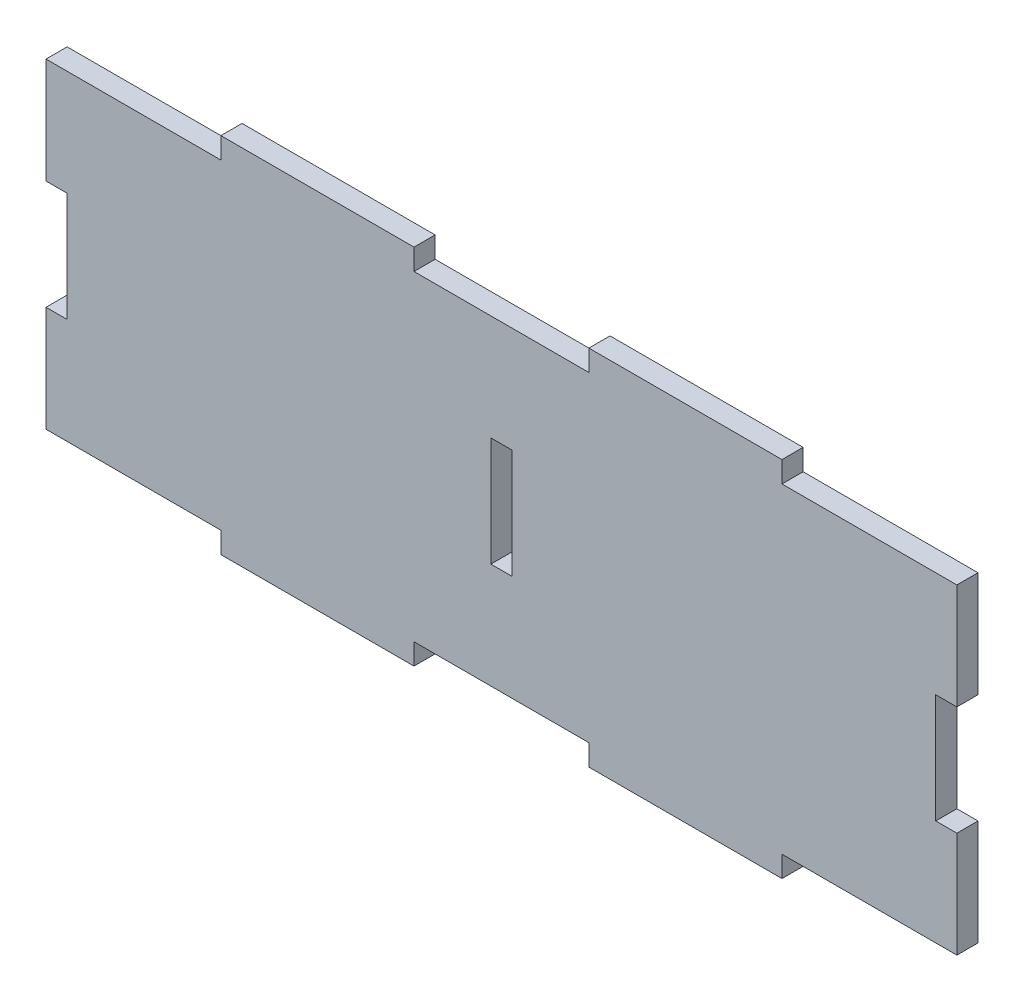
ISO-10303-21;
HEADER;
FILE_DESCRIPTION(('STEP AP214'),'2;1');
FILE_NAME('part.step','',(''),(''),'','','');
FILE_SCHEMA(('AUTOMOTIVE_DESIGN { 1 0 10303 214 1 1 1 1 }'));
ENDSEC;
DATA;
#1=APPLICATION_CONTEXT('core data for automotive mechanical design processes');
#2=APPLICATION_PROTOCOL_DEFINITION('international standard','automotive_design',2000,#1);
#3=PRODUCT_CONTEXT('',#1,'mechanical');
#4=PRODUCT('Part','Part','',(#3));
#5=PRODUCT_RELATED_PRODUCT_CATEGORY('part','',(#4));
#6=PRODUCT_DEFINITION_FORMATION('','',#4);
#7=PRODUCT_DEFINITION_CONTEXT('part definition',#1,'design');
#8=PRODUCT_DEFINITION('design','',#6,#7);
#9=PRODUCT_DEFINITION_SHAPE('','',#8);
#10=(LENGTH_UNIT() NAMED_UNIT(*) SI_UNIT(.MILLI.,.METRE.));
#11=(NAMED_UNIT(*) PLANE_ANGLE_UNIT() SI_UNIT($,.RADIAN.));
#12=(NAMED_UNIT(*) SI_UNIT($,.STERADIAN.) SOLID_ANGLE_UNIT());
#13=UNCERTAINTY_MEASURE_WITH_UNIT(LENGTH_MEASURE(1.E-05),#10,'distance_accuracy_value','');
#14=(GEOMETRIC_REPRESENTATION_CONTEXT(3) GLOBAL_UNCERTAINTY_ASSIGNED_CONTEXT((#13)) GLOBAL_UNIT_ASSIGNED_CONTEXT((#10,
#11,#12)) REPRESENTATION_CONTEXT('',''));
#15=CARTESIAN_POINT('',(0.,0.,0.));
#16=DIRECTION('',(0.,0.,1.));
#17=DIRECTION('',(1.,0.,0.));
#18=AXIS2_PLACEMENT_3D('',#15,#16,#17);
#19=CARTESIAN_POINT('',(0.,0.,5.8));
#20=DIRECTION('',(0.,1.,0.));
#21=DIRECTION('',(0.,0.,1.));
#22=AXIS2_PLACEMENT_3D('',#19,#20,#21);
#23=PLANE('',#22);
#24=DIRECTION('',(1.,0.,0.));
#25=VECTOR('',#24,1.);
#26=CARTESIAN_POINT('',(0.,0.,5.8));
#27=LINE('',#26,#25);
#28=CARTESIAN_POINT('',(202.,0.,5.8));
#29=VERTEX_POINT('',#28);
#30=CARTESIAN_POINT('',(250.,0.,5.8));
#31=VERTEX_POINT('',#30);
#32=EDGE_CURVE('E50',#29,#31,#27,.T.);
#33=ORIENTED_EDGE('',*,*,#32,.F.);
#34=DIRECTION('',(0.,0.,1.));
#35=VECTOR('',#34,1.);
#36=CARTESIAN_POINT('',(202.,0.,-53.3164139829378));
#37=LINE('',#36,#35);
#38=CARTESIAN_POINT('',(202.,0.,0.));
#39=VERTEX_POINT('',#38);
#40=EDGE_CURVE('E256',#39,#29,#37,.T.);
#41=ORIENTED_EDGE('',*,*,#40,.F.);
#42=DIRECTION('',(1.,0.,0.));
#43=VECTOR('',#42,1.);
#44=CARTESIAN_POINT('',(0.,0.,0.));
#45=LINE('',#44,#43);
#46=CARTESIAN_POINT('',(250.,0.,0.));
#47=VERTEX_POINT('',#46);
#48=EDGE_CURVE('E254',#39,#47,#45,.T.);
#49=ORIENTED_EDGE('',*,*,#48,.T.);
#50=DIRECTION('',(0.,0.,-1.));
#51=VECTOR('',#50,1.);
#52=CARTESIAN_POINT('',(250.,0.,5.8));
#53=LINE('',#52,#51);
#54=EDGE_CURVE('E43',#31,#47,#53,.T.);
#55=ORIENTED_EDGE('',*,*,#54,.F.);
#56=EDGE_LOOP('',(#33,#41,#49,#55));
#57=FACE_BOUND('',#56,.T.);
#58=ADVANCED_FACE('F35',(#57),#23,.F.);
#59=CARTESIAN_POINT('',(101.,0.,0.));
#60=VERTEX_POINT('',#59);
#61=CARTESIAN_POINT('',(149.,0.,0.));
#62=VERTEX_POINT('',#61);
#63=EDGE_CURVE('E468',#60,#62,#45,.T.);
#64=ORIENTED_EDGE('',*,*,#63,.T.);
#65=DIRECTION('',(0.,0.,1.));
#66=VECTOR('',#65,1.);
#67=CARTESIAN_POINT('',(149.,0.,-53.3164139829378));
#68=LINE('',#67,#66);
#69=CARTESIAN_POINT('',(149.,0.,5.8));
#70=VERTEX_POINT('',#69);
#71=EDGE_CURVE('E58',#62,#70,#68,.T.);
#72=ORIENTED_EDGE('',*,*,#71,.T.);
#73=CARTESIAN_POINT('',(101.,0.,5.8));
#74=VERTEX_POINT('',#73);
#75=EDGE_CURVE('E451',#74,#70,#27,.T.);
#76=ORIENTED_EDGE('',*,*,#75,.F.);
#77=DIRECTION('',(0.,0.,1.));
#78=VECTOR('',#77,1.);
#79=CARTESIAN_POINT('',(101.,0.,-53.3164139829378));
#80=LINE('',#79,#78);
#81=EDGE_CURVE('E302',#60,#74,#80,.T.);
#82=ORIENTED_EDGE('',*,*,#81,.F.);
#83=EDGE_LOOP('',(#64,#72,#76,#82));
#84=FACE_BOUND('',#83,.T.);
#85=ADVANCED_FACE('F504',(#84),#23,.F.);
#86=CARTESIAN_POINT('',(0.,88.,5.8));
#87=DIRECTION('',(0.,-1.,0.));
#88=DIRECTION('',(0.,0.,-1.));
#89=AXIS2_PLACEMENT_3D('',#86,#87,#88);
#90=PLANE('',#89);
#91=DIRECTION('',(-1.,0.,0.));
#92=VECTOR('',#91,1.);
#93=CARTESIAN_POINT('',(0.,88.,0.));
#94=LINE('',#93,#92);
#95=CARTESIAN_POINT('',(250.,88.,0.));
#96=VERTEX_POINT('',#95);
#97=CARTESIAN_POINT('',(202.,88.,0.));
#98=VERTEX_POINT('',#97);
#99=EDGE_CURVE('E473',#96,#98,#94,.T.);
#100=ORIENTED_EDGE('',*,*,#99,.T.);
#101=DIRECTION('',(0.,0.,1.));
#102=VECTOR('',#101,1.);
#103=CARTESIAN_POINT('',(202.,88.,-53.3164139829378));
#104=LINE('',#103,#102);
#105=CARTESIAN_POINT('',(202.,88.,5.8));
#106=VERTEX_POINT('',#105);
#107=EDGE_CURVE('E312',#98,#106,#104,.T.);
#108=ORIENTED_EDGE('',*,*,#107,.T.);
#109=DIRECTION('',(-1.,0.,0.));
#110=VECTOR('',#109,1.);
#111=CARTESIAN_POINT('',(0.,88.,5.8));
#112=LINE('',#111,#110);
#113=CARTESIAN_POINT('',(250.,88.,5.8));
#114=VERTEX_POINT('',#113);
#115=EDGE_CURVE('E456',#114,#106,#112,.T.);
#116=ORIENTED_EDGE('',*,*,#115,.F.);
#117=DIRECTION('',(0.,0.,-1.));
#118=VECTOR('',#117,1.);
#119=CARTESIAN_POINT('',(250.,88.,5.8));
#120=LINE('',#119,#118);
#121=EDGE_CURVE('E478',#114,#96,#120,.T.);
#122=ORIENTED_EDGE('',*,*,#121,.T.);
#123=EDGE_LOOP('',(#100,#108,#116,#122));
#124=FACE_BOUND('',#123,.T.);
#125=ADVANCED_FACE('F510',(#124),#90,.F.);
#126=DIRECTION('',(0.,0.,1.));
#127=VECTOR('',#126,1.);
#128=CARTESIAN_POINT('',(48.,88.,-53.3164139829378));
#129=LINE('',#128,#127);
#130=CARTESIAN_POINT('',(48.,88.,0.));
#131=VERTEX_POINT('',#130);
#132=CARTESIAN_POINT('',(48.,88.,5.8));
#133=VERTEX_POINT('',#132);
#134=EDGE_CURVE('E347',#131,#133,#129,.T.);
#135=ORIENTED_EDGE('',*,*,#134,.F.);
#136=CARTESIAN_POINT('',(0.,88.,0.));
#137=VERTEX_POINT('',#136);
#138=EDGE_CURVE('E472',#131,#137,#94,.T.);
#139=ORIENTED_EDGE('',*,*,#138,.T.);
#140=DIRECTION('',(0.,0.,-1.));
#141=VECTOR('',#140,1.);
#142=CARTESIAN_POINT('',(0.,88.,5.8));
#143=LINE('',#142,#141);
#144=CARTESIAN_POINT('',(0.,88.,5.8));
#145=VERTEX_POINT('',#144);
#146=EDGE_CURVE('E459',#145,#137,#143,.T.);
#147=ORIENTED_EDGE('',*,*,#146,.F.);
#148=EDGE_CURVE('E455',#133,#145,#112,.T.);
#149=ORIENTED_EDGE('',*,*,#148,.F.);
#150=EDGE_LOOP('',(#135,#139,#147,#149));
#151=FACE_BOUND('',#150,.T.);
#152=ADVANCED_FACE('F552',(#151),#90,.F.);
#153=CARTESIAN_POINT('',(0.,0.,5.8));
#154=DIRECTION('',(1.,0.,0.));
#155=DIRECTION('',(0.,0.,-1.));
#156=AXIS2_PLACEMENT_3D('',#153,#154,#155);
#157=PLANE('',#156);
#158=DIRECTION('',(0.,-1.,0.));
#159=VECTOR('',#158,1.);
#160=CARTESIAN_POINT('',(0.,0.,5.8));
#161=LINE('',#160,#159);
#162=CARTESIAN_POINT('',(0.,29.,5.8));
#163=VERTEX_POINT('',#162);
#164=CARTESIAN_POINT('',(0.,0.,5.8));
#165=VERTEX_POINT('',#164);
#166=EDGE_CURVE('E446',#163,#165,#161,.T.);
#167=ORIENTED_EDGE('',*,*,#166,.F.);
#168=DIRECTION('',(0.,0.,-1.));
#169=VECTOR('',#168,1.);
#170=CARTESIAN_POINT('',(0.,29.,5.801));
#171=LINE('',#170,#169);
#172=CARTESIAN_POINT('',(0.,29.,0.));
#173=VERTEX_POINT('',#172);
#174=EDGE_CURVE('E409',#163,#173,#171,.T.);
#175=ORIENTED_EDGE('',*,*,#174,.T.);
#176=DIRECTION('',(0.,-1.,0.));
#177=VECTOR('',#176,1.);
#178=CARTESIAN_POINT('',(0.,0.,0.));
#179=LINE('',#178,#177);
#180=CARTESIAN_POINT('',(0.,0.,0.));
#181=VERTEX_POINT('',#180);
#182=EDGE_CURVE('E442',#173,#181,#179,.T.);
#183=ORIENTED_EDGE('',*,*,#182,.T.);
#184=DIRECTION('',(0.,0.,-1.));
#185=VECTOR('',#184,1.);
#186=CARTESIAN_POINT('',(0.,0.,5.8));
#187=LINE('',#186,#185);
#188=EDGE_CURVE('E11',#165,#181,#187,.T.);
#189=ORIENTED_EDGE('',*,*,#188,.F.);
#190=EDGE_LOOP('',(#167,#175,#183,#189));
#191=FACE_BOUND('',#190,.T.);
#192=ADVANCED_FACE('F523',(#191),#157,.F.);
#193=CARTESIAN_POINT('',(250.,0.,5.8));
#194=DIRECTION('',(-1.,0.,0.));
#195=DIRECTION('',(0.,0.,1.));
#196=AXIS2_PLACEMENT_3D('',#193,#194,#195);
#197=PLANE('',#196);
#198=DIRECTION('',(0.,1.,0.));
#199=VECTOR('',#198,1.);
#200=CARTESIAN_POINT('',(250.,0.,5.8));
#201=LINE('',#200,#199);
#202=CARTESIAN_POINT('',(250.,59.,5.8));
#203=VERTEX_POINT('',#202);
#204=EDGE_CURVE('E450',#203,#114,#201,.T.);
#205=ORIENTED_EDGE('',*,*,#204,.F.);
#206=DIRECTION('',(0.,0.,-1.));
#207=VECTOR('',#206,1.);
#208=CARTESIAN_POINT('',(250.,59.,5.801));
#209=LINE('',#208,#207);
#210=CARTESIAN_POINT('',(250.,59.,0.));
#211=VERTEX_POINT('',#210);
#212=EDGE_CURVE('E432',#203,#211,#209,.T.);
#213=ORIENTED_EDGE('',*,*,#212,.T.);
#214=DIRECTION('',(0.,1.,0.));
#215=VECTOR('',#214,1.);
#216=CARTESIAN_POINT('',(250.,0.,0.));
#217=LINE('',#216,#215);
#218=EDGE_CURVE('E467',#211,#96,#217,.T.);
#219=ORIENTED_EDGE('',*,*,#218,.T.);
#220=ORIENTED_EDGE('',*,*,#121,.F.);
#221=EDGE_LOOP('',(#205,#213,#219,#220));
#222=FACE_BOUND('',#221,.T.);
#223=ADVANCED_FACE('F520',(#222),#197,.F.);
#224=CARTESIAN_POINT('',(0.,59.,0.));
#225=VERTEX_POINT('',#224);
#226=EDGE_CURVE('E461',#137,#225,#179,.T.);
#227=ORIENTED_EDGE('',*,*,#226,.T.);
#228=DIRECTION('',(0.,0.,-1.));
#229=VECTOR('',#228,1.);
#230=CARTESIAN_POINT('',(0.,59.,5.801));
#231=LINE('',#230,#229);
#232=CARTESIAN_POINT('',(0.,59.,5.8));
#233=VERTEX_POINT('',#232);
#234=EDGE_CURVE('E408',#233,#225,#231,.T.);
#235=ORIENTED_EDGE('',*,*,#234,.F.);
#236=EDGE_CURVE('E443',#145,#233,#161,.T.);
#237=ORIENTED_EDGE('',*,*,#236,.F.);
#238=ORIENTED_EDGE('',*,*,#146,.T.);
#239=EDGE_LOOP('',(#227,#235,#237,#238));
#240=FACE_BOUND('',#239,.T.);
#241=ADVANCED_FACE('F37',(#240),#157,.F.);
#242=CARTESIAN_POINT('',(48.,0.,0.));
#243=VERTEX_POINT('',#242);
#244=EDGE_CURVE('E464',#181,#243,#45,.T.);
#245=ORIENTED_EDGE('',*,*,#244,.T.);
#246=DIRECTION('',(0.,0.,1.));
#247=VECTOR('',#246,1.);
#248=CARTESIAN_POINT('',(48.,0.,-53.3164139829378));
#249=LINE('',#248,#247);
#250=CARTESIAN_POINT('',(48.,0.,5.8));
#251=VERTEX_POINT('',#250);
#252=EDGE_CURVE('E299',#243,#251,#249,.T.);
#253=ORIENTED_EDGE('',*,*,#252,.T.);
#254=EDGE_CURVE('E447',#165,#251,#27,.T.);
#255=ORIENTED_EDGE('',*,*,#254,.F.);
#256=ORIENTED_EDGE('',*,*,#188,.T.);
#257=EDGE_LOOP('',(#245,#253,#255,#256));
#258=FACE_BOUND('',#257,.T.);
#259=ADVANCED_FACE('F505',(#258),#23,.F.);
#260=CARTESIAN_POINT('',(250.,29.,0.));
#261=VERTEX_POINT('',#260);
#262=EDGE_CURVE('E469',#47,#261,#217,.T.);
#263=ORIENTED_EDGE('',*,*,#262,.T.);
#264=DIRECTION('',(0.,0.,-1.));
#265=VECTOR('',#264,1.);
#266=CARTESIAN_POINT('',(250.,29.,5.801));
#267=LINE('',#266,#265);
#268=CARTESIAN_POINT('',(250.,29.,5.8));
#269=VERTEX_POINT('',#268);
#270=EDGE_CURVE('E431',#269,#261,#267,.T.);
#271=ORIENTED_EDGE('',*,*,#270,.F.);
#272=EDGE_CURVE('E452',#31,#269,#201,.T.);
#273=ORIENTED_EDGE('',*,*,#272,.F.);
#274=ORIENTED_EDGE('',*,*,#54,.T.);
#275=EDGE_LOOP('',(#263,#271,#273,#274));
#276=FACE_BOUND('',#275,.T.);
#277=ADVANCED_FACE('F483',(#276),#197,.F.);
#278=CARTESIAN_POINT('',(149.,88.,5.8));
#279=VERTEX_POINT('',#278);
#280=CARTESIAN_POINT('',(101.,88.,5.8));
#281=VERTEX_POINT('',#280);
#282=EDGE_CURVE('E460',#279,#281,#112,.T.);
#283=ORIENTED_EDGE('',*,*,#282,.F.);
#284=DIRECTION('',(0.,0.,1.));
#285=VECTOR('',#284,1.);
#286=CARTESIAN_POINT('',(149.,88.,-53.3164139829378));
#287=LINE('',#286,#285);
#288=CARTESIAN_POINT('',(149.,88.,0.));
#289=VERTEX_POINT('',#288);
#290=EDGE_CURVE('E321',#289,#279,#287,.T.);
#291=ORIENTED_EDGE('',*,*,#290,.F.);
#292=CARTESIAN_POINT('',(101.,88.,0.));
#293=VERTEX_POINT('',#292);
#294=EDGE_CURVE('E475',#289,#293,#94,.T.);
#295=ORIENTED_EDGE('',*,*,#294,.T.);
#296=DIRECTION('',(0.,0.,1.));
#297=VECTOR('',#296,1.);
#298=CARTESIAN_POINT('',(101.,88.,-53.3164139829378));
#299=LINE('',#298,#297);
#300=EDGE_CURVE('E339',#293,#281,#299,.T.);
#301=ORIENTED_EDGE('',*,*,#300,.T.);
#302=EDGE_LOOP('',(#283,#291,#295,#301));
#303=FACE_BOUND('',#302,.T.);
#304=ADVANCED_FACE('F519',(#303),#90,.F.);
#305=CARTESIAN_POINT('',(0.,0.,5.8));
#306=DIRECTION('',(0.,0.,-1.));
#307=DIRECTION('',(-1.,0.,0.));
#308=AXIS2_PLACEMENT_3D('',#305,#306,#307);
#309=PLANE('',#308);
#310=DIRECTION('',(-1.,0.,0.));
#311=VECTOR('',#310,1.);
#312=CARTESIAN_POINT('',(127.9,59.,5.8));
#313=LINE('',#312,#311);
#314=CARTESIAN_POINT('',(127.9,59.,5.8));
#315=VERTEX_POINT('',#314);
#316=CARTESIAN_POINT('',(122.1,59.,5.8));
#317=VERTEX_POINT('',#316);
#318=EDGE_CURVE('E364',#315,#317,#313,.T.);
#319=ORIENTED_EDGE('',*,*,#318,.F.);
#320=DIRECTION('',(0.,1.,0.));
#321=VECTOR('',#320,1.);
#322=CARTESIAN_POINT('',(127.9,59.,5.8));
#323=LINE('',#322,#321);
#324=CARTESIAN_POINT('',(127.9,29.,5.8));
#325=VERTEX_POINT('',#324);
#326=EDGE_CURVE('E368',#325,#315,#323,.T.);
#327=ORIENTED_EDGE('',*,*,#326,.F.);
#328=DIRECTION('',(1.,0.,0.));
#329=VECTOR('',#328,1.);
#330=CARTESIAN_POINT('',(127.9,29.,5.8));
#331=LINE('',#330,#329);
#332=CARTESIAN_POINT('',(122.1,29.,5.8));
#333=VERTEX_POINT('',#332);
#334=EDGE_CURVE('E385',#333,#325,#331,.T.);
#335=ORIENTED_EDGE('',*,*,#334,.F.);
#336=DIRECTION('',(0.,-1.,0.));
#337=VECTOR('',#336,1.);
#338=CARTESIAN_POINT('',(122.1,59.,5.8));
#339=LINE('',#338,#337);
#340=EDGE_CURVE('E362',#317,#333,#339,.T.);
#341=ORIENTED_EDGE('',*,*,#340,.F.);
#342=EDGE_LOOP('',(#319,#327,#335,#341));
#343=FACE_BOUND('',#342,.T.);
#344=DIRECTION('',(0.,1.,0.));
#345=VECTOR('',#344,1.);
#346=CARTESIAN_POINT('',(5.8,59.,5.8));
#347=LINE('',#346,#345);
#348=CARTESIAN_POINT('',(5.8,29.,5.8));
#349=VERTEX_POINT('',#348);
#350=CARTESIAN_POINT('',(5.8,59.,5.8));
#351=VERTEX_POINT('',#350);
#352=EDGE_CURVE('E361',#349,#351,#347,.T.);
#353=ORIENTED_EDGE('',*,*,#352,.F.);
#354=DIRECTION('',(1.,0.,0.));
#355=VECTOR('',#354,1.);
#356=CARTESIAN_POINT('',(0.,29.,5.8));
#357=LINE('',#356,#355);
#358=EDGE_CURVE('E397',#163,#349,#357,.T.);
#359=ORIENTED_EDGE('',*,*,#358,.F.);
#360=ORIENTED_EDGE('',*,*,#166,.T.);
#361=ORIENTED_EDGE('',*,*,#254,.T.);
#362=DIRECTION('',(0.,-1.,0.));
#363=VECTOR('',#362,1.);
#364=CARTESIAN_POINT('',(48.,0.,5.8));
#365=LINE('',#364,#363);
#366=CARTESIAN_POINT('',(48.,-5.8,5.8));
#367=VERTEX_POINT('',#366);
#368=EDGE_CURVE('E282',#251,#367,#365,.T.);
#369=ORIENTED_EDGE('',*,*,#368,.T.);
#370=DIRECTION('',(1.,0.,0.));
#371=VECTOR('',#370,1.);
#372=CARTESIAN_POINT('',(48.,-5.8,5.8));
#373=LINE('',#372,#371);
#374=CARTESIAN_POINT('',(101.,-5.8,5.8));
#375=VERTEX_POINT('',#374);
#376=EDGE_CURVE('E287',#367,#375,#373,.T.);
#377=ORIENTED_EDGE('',*,*,#376,.T.);
#378=DIRECTION('',(0.,1.,0.));
#379=VECTOR('',#378,1.);
#380=CARTESIAN_POINT('',(101.,0.,5.8));
#381=LINE('',#380,#379);
#382=EDGE_CURVE('E283',#375,#74,#381,.T.);
#383=ORIENTED_EDGE('',*,*,#382,.T.);
#384=ORIENTED_EDGE('',*,*,#75,.T.);
#385=DIRECTION('',(0.,-1.,0.));
#386=VECTOR('',#385,1.);
#387=CARTESIAN_POINT('',(149.,0.,5.8));
#388=LINE('',#387,#386);
#389=CARTESIAN_POINT('',(149.,-5.8,5.8));
#390=VERTEX_POINT('',#389);
#391=EDGE_CURVE('E275',#70,#390,#388,.T.);
#392=ORIENTED_EDGE('',*,*,#391,.T.);
#393=DIRECTION('',(1.,0.,0.));
#394=VECTOR('',#393,1.);
#395=CARTESIAN_POINT('',(149.,-5.8,5.8));
#396=LINE('',#395,#394);
#397=CARTESIAN_POINT('',(202.,-5.8,5.8));
#398=VERTEX_POINT('',#397);
#399=EDGE_CURVE('E271',#390,#398,#396,.T.);
#400=ORIENTED_EDGE('',*,*,#399,.T.);
#401=DIRECTION('',(0.,1.,0.));
#402=VECTOR('',#401,1.);
#403=CARTESIAN_POINT('',(202.,0.,5.8));
#404=LINE('',#403,#402);
#405=EDGE_CURVE('E262',#398,#29,#404,.T.);
#406=ORIENTED_EDGE('',*,*,#405,.T.);
#407=ORIENTED_EDGE('',*,*,#32,.T.);
#408=ORIENTED_EDGE('',*,*,#272,.T.);
#409=DIRECTION('',(1.,0.,0.));
#410=VECTOR('',#409,1.);
#411=CARTESIAN_POINT('',(250.,29.,5.8));
#412=LINE('',#411,#410);
#413=CARTESIAN_POINT('',(244.2,29.,5.8));
#414=VERTEX_POINT('',#413);
#415=EDGE_CURVE('E435',#414,#269,#412,.T.);
#416=ORIENTED_EDGE('',*,*,#415,.F.);
#417=DIRECTION('',(0.,-1.,0.));
#418=VECTOR('',#417,1.);
#419=CARTESIAN_POINT('',(244.2,59.,5.8));
#420=LINE('',#419,#418);
#421=CARTESIAN_POINT('',(244.2,59.,5.8));
#422=VERTEX_POINT('',#421);
#423=EDGE_CURVE('E394',#422,#414,#420,.T.);
#424=ORIENTED_EDGE('',*,*,#423,.F.);
#425=DIRECTION('',(-1.,0.,0.));
#426=VECTOR('',#425,1.);
#427=CARTESIAN_POINT('',(250.,59.,5.8));
#428=LINE('',#427,#426);
#429=EDGE_CURVE('E420',#203,#422,#428,.T.);
#430=ORIENTED_EDGE('',*,*,#429,.F.);
#431=ORIENTED_EDGE('',*,*,#204,.T.);
#432=ORIENTED_EDGE('',*,*,#115,.T.);
#433=DIRECTION('',(0.,1.,0.));
#434=VECTOR('',#433,1.);
#435=CARTESIAN_POINT('',(202.,88.,5.8));
#436=LINE('',#435,#434);
#437=CARTESIAN_POINT('',(202.,93.8,5.8));
#438=VERTEX_POINT('',#437);
#439=EDGE_CURVE('E313',#106,#438,#436,.T.);
#440=ORIENTED_EDGE('',*,*,#439,.T.);
#441=DIRECTION('',(-1.,0.,0.));
#442=VECTOR('',#441,1.);
#443=CARTESIAN_POINT('',(149.,93.8,5.8));
#444=LINE('',#443,#442);
#445=CARTESIAN_POINT('',(149.,93.8,5.8));
#446=VERTEX_POINT('',#445);
#447=EDGE_CURVE('E309',#438,#446,#444,.T.);
#448=ORIENTED_EDGE('',*,*,#447,.T.);
#449=DIRECTION('',(0.,-1.,0.));
#450=VECTOR('',#449,1.);
#451=CARTESIAN_POINT('',(149.,88.,5.8));
#452=LINE('',#451,#450);
#453=EDGE_CURVE('E308',#446,#279,#452,.T.);
#454=ORIENTED_EDGE('',*,*,#453,.T.);
#455=ORIENTED_EDGE('',*,*,#282,.T.);
#456=DIRECTION('',(0.,1.,0.));
#457=VECTOR('',#456,1.);
#458=CARTESIAN_POINT('',(101.,88.,5.8));
#459=LINE('',#458,#457);
#460=CARTESIAN_POINT('',(101.,93.8,5.8));
#461=VERTEX_POINT('',#460);
#462=EDGE_CURVE('E340',#281,#461,#459,.T.);
#463=ORIENTED_EDGE('',*,*,#462,.T.);
#464=DIRECTION('',(-1.,0.,0.));
#465=VECTOR('',#464,1.);
#466=CARTESIAN_POINT('',(48.,93.8,5.8));
#467=LINE('',#466,#465);
#468=CARTESIAN_POINT('',(48.,93.8,5.8));
#469=VERTEX_POINT('',#468);
#470=EDGE_CURVE('E336',#461,#469,#467,.T.);
#471=ORIENTED_EDGE('',*,*,#470,.T.);
#472=DIRECTION('',(0.,-1.,0.));
#473=VECTOR('',#472,1.);
#474=CARTESIAN_POINT('',(48.,88.,5.8));
#475=LINE('',#474,#473);
#476=EDGE_CURVE('E335',#469,#133,#475,.T.);
#477=ORIENTED_EDGE('',*,*,#476,.T.);
#478=ORIENTED_EDGE('',*,*,#148,.T.);
#479=ORIENTED_EDGE('',*,*,#236,.T.);
#480=DIRECTION('',(-1.,0.,0.));
#481=VECTOR('',#480,1.);
#482=CARTESIAN_POINT('',(0.,59.,5.8));
#483=LINE('',#482,#481);
#484=EDGE_CURVE('E365',#351,#233,#483,.T.);
#485=ORIENTED_EDGE('',*,*,#484,.F.);
#486=EDGE_LOOP('',(#353,#359,#360,#361,#369,#377,#383,#384,#392,#400,#406,#407,#408,#416,#424,
#430,#431,#432,#440,#448,#454,#455,#463,#471,#477,#478,#479,#485));
#487=FACE_BOUND('',#486,.T.);
#488=ADVANCED_FACE('F493',(#343,#487),#309,.F.);
#489=CARTESIAN_POINT('',(0.,0.,0.));
#490=DIRECTION('',(0.,0.,-1.));
#491=DIRECTION('',(-1.,0.,0.));
#492=AXIS2_PLACEMENT_3D('',#489,#490,#491);
#493=PLANE('',#492);
#494=DIRECTION('',(0.,-1.,0.));
#495=VECTOR('',#494,1.);
#496=CARTESIAN_POINT('',(127.9,59.,0.));
#497=LINE('',#496,#495);
#498=CARTESIAN_POINT('',(127.9,59.,0.));
#499=VERTEX_POINT('',#498);
#500=CARTESIAN_POINT('',(127.9,29.,0.));
#501=VERTEX_POINT('',#500);
#502=EDGE_CURVE('E371',#499,#501,#497,.T.);
#503=ORIENTED_EDGE('',*,*,#502,.F.);
#504=DIRECTION('',(1.,0.,0.));
#505=VECTOR('',#504,1.);
#506=CARTESIAN_POINT('',(127.9,59.,0.));
#507=LINE('',#506,#505);
#508=CARTESIAN_POINT('',(122.1,59.,0.));
#509=VERTEX_POINT('',#508);
#510=EDGE_CURVE('E379',#509,#499,#507,.T.);
#511=ORIENTED_EDGE('',*,*,#510,.F.);
#512=DIRECTION('',(0.,1.,0.));
#513=VECTOR('',#512,1.);
#514=CARTESIAN_POINT('',(122.1,59.,0.));
#515=LINE('',#514,#513);
#516=CARTESIAN_POINT('',(122.1,29.,0.));
#517=VERTEX_POINT('',#516);
#518=EDGE_CURVE('E376',#517,#509,#515,.T.);
#519=ORIENTED_EDGE('',*,*,#518,.F.);
#520=DIRECTION('',(-1.,0.,0.));
#521=VECTOR('',#520,1.);
#522=CARTESIAN_POINT('',(127.9,29.,0.));
#523=LINE('',#522,#521);
#524=EDGE_CURVE('E373',#501,#517,#523,.T.);
#525=ORIENTED_EDGE('',*,*,#524,.F.);
#526=EDGE_LOOP('',(#503,#511,#519,#525));
#527=FACE_BOUND('',#526,.T.);
#528=DIRECTION('',(-1.,0.,0.));
#529=VECTOR('',#528,1.);
#530=CARTESIAN_POINT('',(0.,29.,0.));
#531=LINE('',#530,#529);
#532=CARTESIAN_POINT('',(5.8,29.,0.));
#533=VERTEX_POINT('',#532);
#534=EDGE_CURVE('E406',#533,#173,#531,.T.);
#535=ORIENTED_EDGE('',*,*,#534,.F.);
#536=DIRECTION('',(0.,-1.,0.));
#537=VECTOR('',#536,1.);
#538=CARTESIAN_POINT('',(5.8,59.,0.));
#539=LINE('',#538,#537);
#540=CARTESIAN_POINT('',(5.8,59.,0.));
#541=VERTEX_POINT('',#540);
#542=EDGE_CURVE('E403',#541,#533,#539,.T.);
#543=ORIENTED_EDGE('',*,*,#542,.F.);
#544=DIRECTION('',(1.,0.,0.));
#545=VECTOR('',#544,1.);
#546=CARTESIAN_POINT('',(0.,59.,0.));
#547=LINE('',#546,#545);
#548=EDGE_CURVE('E400',#225,#541,#547,.T.);
#549=ORIENTED_EDGE('',*,*,#548,.F.);
#550=ORIENTED_EDGE('',*,*,#226,.F.);
#551=ORIENTED_EDGE('',*,*,#138,.F.);
#552=DIRECTION('',(0.,-1.,0.));
#553=VECTOR('',#552,1.);
#554=CARTESIAN_POINT('',(48.,88.,0.));
#555=LINE('',#554,#553);
#556=CARTESIAN_POINT('',(48.,93.8,0.));
#557=VERTEX_POINT('',#556);
#558=EDGE_CURVE('E345',#557,#131,#555,.T.);
#559=ORIENTED_EDGE('',*,*,#558,.F.);
#560=DIRECTION('',(-1.,0.,0.));
#561=VECTOR('',#560,1.);
#562=CARTESIAN_POINT('',(48.,93.8,0.));
#563=LINE('',#562,#561);
#564=CARTESIAN_POINT('',(101.,93.8,0.));
#565=VERTEX_POINT('',#564);
#566=EDGE_CURVE('E349',#565,#557,#563,.T.);
#567=ORIENTED_EDGE('',*,*,#566,.F.);
#568=DIRECTION('',(0.,1.,0.));
#569=VECTOR('',#568,1.);
#570=CARTESIAN_POINT('',(101.,88.,0.));
#571=LINE('',#570,#569);
#572=EDGE_CURVE('E353',#293,#565,#571,.T.);
#573=ORIENTED_EDGE('',*,*,#572,.F.);
#574=ORIENTED_EDGE('',*,*,#294,.F.);
#575=DIRECTION('',(0.,-1.,0.));
#576=VECTOR('',#575,1.);
#577=CARTESIAN_POINT('',(149.,88.,0.));
#578=LINE('',#577,#576);
#579=CARTESIAN_POINT('',(149.,93.8,0.));
#580=VERTEX_POINT('',#579);
#581=EDGE_CURVE('E318',#580,#289,#578,.T.);
#582=ORIENTED_EDGE('',*,*,#581,.F.);
#583=DIRECTION('',(-1.,0.,0.));
#584=VECTOR('',#583,1.);
#585=CARTESIAN_POINT('',(149.,93.8,0.));
#586=LINE('',#585,#584);
#587=CARTESIAN_POINT('',(202.,93.8,0.));
#588=VERTEX_POINT('',#587);
#589=EDGE_CURVE('E323',#588,#580,#586,.T.);
#590=ORIENTED_EDGE('',*,*,#589,.F.);
#591=DIRECTION('',(0.,1.,0.));
#592=VECTOR('',#591,1.);
#593=CARTESIAN_POINT('',(202.,88.,0.));
#594=LINE('',#593,#592);
#595=EDGE_CURVE('E327',#98,#588,#594,.T.);
#596=ORIENTED_EDGE('',*,*,#595,.F.);
#597=ORIENTED_EDGE('',*,*,#99,.F.);
#598=ORIENTED_EDGE('',*,*,#218,.F.);
#599=DIRECTION('',(1.,0.,0.));
#600=VECTOR('',#599,1.);
#601=CARTESIAN_POINT('',(250.,59.,0.));
#602=LINE('',#601,#600);
#603=CARTESIAN_POINT('',(244.2,59.,0.));
#604=VERTEX_POINT('',#603);
#605=EDGE_CURVE('E429',#604,#211,#602,.T.);
#606=ORIENTED_EDGE('',*,*,#605,.F.);
#607=DIRECTION('',(0.,1.,0.));
#608=VECTOR('',#607,1.);
#609=CARTESIAN_POINT('',(244.2,59.,0.));
#610=LINE('',#609,#608);
#611=CARTESIAN_POINT('',(244.2,29.,0.));
#612=VERTEX_POINT('',#611);
#613=EDGE_CURVE('E426',#612,#604,#610,.T.);
#614=ORIENTED_EDGE('',*,*,#613,.F.);
#615=DIRECTION('',(-1.,0.,0.));
#616=VECTOR('',#615,1.);
#617=CARTESIAN_POINT('',(250.,29.,0.));
#618=LINE('',#617,#616);
#619=EDGE_CURVE('E423',#261,#612,#618,.T.);
#620=ORIENTED_EDGE('',*,*,#619,.F.);
#621=ORIENTED_EDGE('',*,*,#262,.F.);
#622=ORIENTED_EDGE('',*,*,#48,.F.);
#623=DIRECTION('',(0.,1.,0.));
#624=VECTOR('',#623,1.);
#625=CARTESIAN_POINT('',(202.,0.,0.));
#626=LINE('',#625,#624);
#627=CARTESIAN_POINT('',(202.,-5.8,0.));
#628=VERTEX_POINT('',#627);
#629=EDGE_CURVE('E245',#628,#39,#626,.T.);
#630=ORIENTED_EDGE('',*,*,#629,.F.);
#631=DIRECTION('',(1.,0.,0.));
#632=VECTOR('',#631,1.);
#633=CARTESIAN_POINT('',(149.,-5.8,0.));
#634=LINE('',#633,#632);
#635=CARTESIAN_POINT('',(149.,-5.8,0.));
#636=VERTEX_POINT('',#635);
#637=EDGE_CURVE('E251',#636,#628,#634,.T.);
#638=ORIENTED_EDGE('',*,*,#637,.F.);
#639=DIRECTION('',(0.,-1.,0.));
#640=VECTOR('',#639,1.);
#641=CARTESIAN_POINT('',(149.,0.,0.));
#642=LINE('',#641,#640);
#643=EDGE_CURVE('E277',#62,#636,#642,.T.);
#644=ORIENTED_EDGE('',*,*,#643,.F.);
#645=ORIENTED_EDGE('',*,*,#63,.F.);
#646=DIRECTION('',(0.,1.,0.));
#647=VECTOR('',#646,1.);
#648=CARTESIAN_POINT('',(101.,0.,0.));
#649=LINE('',#648,#647);
#650=CARTESIAN_POINT('',(101.,-5.8,0.));
#651=VERTEX_POINT('',#650);
#652=EDGE_CURVE('E300',#651,#60,#649,.T.);
#653=ORIENTED_EDGE('',*,*,#652,.F.);
#654=DIRECTION('',(1.,0.,0.));
#655=VECTOR('',#654,1.);
#656=CARTESIAN_POINT('',(48.,-5.8,0.));
#657=LINE('',#656,#655);
#658=CARTESIAN_POINT('',(48.,-5.8,0.));
#659=VERTEX_POINT('',#658);
#660=EDGE_CURVE('E286',#659,#651,#657,.T.);
#661=ORIENTED_EDGE('',*,*,#660,.F.);
#662=DIRECTION('',(0.,-1.,0.));
#663=VECTOR('',#662,1.);
#664=CARTESIAN_POINT('',(48.,0.,0.));
#665=LINE('',#664,#663);
#666=EDGE_CURVE('E295',#243,#659,#665,.T.);
#667=ORIENTED_EDGE('',*,*,#666,.F.);
#668=ORIENTED_EDGE('',*,*,#244,.F.);
#669=ORIENTED_EDGE('',*,*,#182,.F.);
#670=EDGE_LOOP('',(#535,#543,#549,#550,#551,#559,#567,#573,#574,#582,#590,#596,#597,#598,#606,
#614,#620,#621,#622,#630,#638,#644,#645,#653,#661,#667,#668,#669));
#671=FACE_BOUND('',#670,.T.);
#672=ADVANCED_FACE('F248',(#527,#671),#493,.T.);
#673=CARTESIAN_POINT('',(250.,59.,5.801));
#674=DIRECTION('',(0.,1.,0.));
#675=DIRECTION('',(-1.,0.,0.));
#676=AXIS2_PLACEMENT_3D('',#673,#674,#675);
#677=PLANE('',#676);
#678=ORIENTED_EDGE('',*,*,#429,.T.);
#679=DIRECTION('',(0.,0.,-1.));
#680=VECTOR('',#679,1.);
#681=CARTESIAN_POINT('',(244.2,59.,5.801));
#682=LINE('',#681,#680);
#683=EDGE_CURVE('E436',#422,#604,#682,.T.);
#684=ORIENTED_EDGE('',*,*,#683,.T.);
#685=ORIENTED_EDGE('',*,*,#605,.T.);
#686=ORIENTED_EDGE('',*,*,#212,.F.);
#687=EDGE_LOOP('',(#678,#684,#685,#686));
#688=FACE_BOUND('',#687,.T.);
#689=ADVANCED_FACE('F606',(#688),#677,.F.);
#690=CARTESIAN_POINT('',(244.2,59.,5.801));
#691=DIRECTION('',(-1.,0.,0.));
#692=DIRECTION('',(0.,0.,1.));
#693=AXIS2_PLACEMENT_3D('',#690,#691,#692);
#694=PLANE('',#693);
#695=ORIENTED_EDGE('',*,*,#423,.T.);
#696=DIRECTION('',(0.,0.,-1.));
#697=VECTOR('',#696,1.);
#698=CARTESIAN_POINT('',(244.2,29.,5.801));
#699=LINE('',#698,#697);
#700=EDGE_CURVE('E438',#414,#612,#699,.T.);
#701=ORIENTED_EDGE('',*,*,#700,.T.);
#702=ORIENTED_EDGE('',*,*,#613,.T.);
#703=ORIENTED_EDGE('',*,*,#683,.F.);
#704=EDGE_LOOP('',(#695,#701,#702,#703));
#705=FACE_BOUND('',#704,.T.);
#706=ADVANCED_FACE('F609',(#705),#694,.F.);
#707=CARTESIAN_POINT('',(250.,29.,5.801));
#708=DIRECTION('',(0.,-1.,0.));
#709=DIRECTION('',(1.,0.,0.));
#710=AXIS2_PLACEMENT_3D('',#707,#708,#709);
#711=PLANE('',#710);
#712=ORIENTED_EDGE('',*,*,#415,.T.);
#713=ORIENTED_EDGE('',*,*,#270,.T.);
#714=ORIENTED_EDGE('',*,*,#619,.T.);
#715=ORIENTED_EDGE('',*,*,#700,.F.);
#716=EDGE_LOOP('',(#712,#713,#714,#715));
#717=FACE_BOUND('',#716,.T.);
#718=ADVANCED_FACE('F489',(#717),#711,.F.);
#719=CARTESIAN_POINT('',(0.,29.,5.801));
#720=DIRECTION('',(0.,-1.,0.));
#721=DIRECTION('',(0.,0.,-1.));
#722=AXIS2_PLACEMENT_3D('',#719,#720,#721);
#723=PLANE('',#722);
#724=ORIENTED_EDGE('',*,*,#358,.T.);
#725=DIRECTION('',(0.,0.,-1.));
#726=VECTOR('',#725,1.);
#727=CARTESIAN_POINT('',(5.8,29.,5.801));
#728=LINE('',#727,#726);
#729=EDGE_CURVE('E412',#349,#533,#728,.T.);
#730=ORIENTED_EDGE('',*,*,#729,.T.);
#731=ORIENTED_EDGE('',*,*,#534,.T.);
#732=ORIENTED_EDGE('',*,*,#174,.F.);
#733=EDGE_LOOP('',(#724,#730,#731,#732));
#734=FACE_BOUND('',#733,.T.);
#735=ADVANCED_FACE('F537',(#734),#723,.F.);
#736=CARTESIAN_POINT('',(5.8,59.,5.801));
#737=DIRECTION('',(1.,0.,0.));
#738=DIRECTION('',(0.,1.,0.));
#739=AXIS2_PLACEMENT_3D('',#736,#737,#738);
#740=PLANE('',#739);
#741=ORIENTED_EDGE('',*,*,#352,.T.);
#742=DIRECTION('',(0.,0.,-1.));
#743=VECTOR('',#742,1.);
#744=CARTESIAN_POINT('',(5.8,59.,5.801));
#745=LINE('',#744,#743);
#746=EDGE_CURVE('E414',#351,#541,#745,.T.);
#747=ORIENTED_EDGE('',*,*,#746,.T.);
#748=ORIENTED_EDGE('',*,*,#542,.T.);
#749=ORIENTED_EDGE('',*,*,#729,.F.);
#750=EDGE_LOOP('',(#741,#747,#748,#749));
#751=FACE_BOUND('',#750,.T.);
#752=ADVANCED_FACE('F540',(#751),#740,.F.);
#753=CARTESIAN_POINT('',(0.,59.,5.801));
#754=DIRECTION('',(0.,1.,0.));
#755=DIRECTION('',(0.,0.,1.));
#756=AXIS2_PLACEMENT_3D('',#753,#754,#755);
#757=PLANE('',#756);
#758=ORIENTED_EDGE('',*,*,#484,.T.);
#759=ORIENTED_EDGE('',*,*,#234,.T.);
#760=ORIENTED_EDGE('',*,*,#548,.T.);
#761=ORIENTED_EDGE('',*,*,#746,.F.);
#762=EDGE_LOOP('',(#758,#759,#760,#761));
#763=FACE_BOUND('',#762,.T.);
#764=ADVANCED_FACE('F598',(#763),#757,.F.);
#765=CARTESIAN_POINT('',(127.9,59.,5.801));
#766=DIRECTION('',(1.,0.,0.));
#767=DIRECTION('',(0.,0.,-1.));
#768=AXIS2_PLACEMENT_3D('',#765,#766,#767);
#769=PLANE('',#768);
#770=ORIENTED_EDGE('',*,*,#326,.T.);
#771=DIRECTION('',(0.,0.,-1.));
#772=VECTOR('',#771,1.);
#773=CARTESIAN_POINT('',(127.9,59.,5.801));
#774=LINE('',#773,#772);
#775=EDGE_CURVE('E383',#315,#499,#774,.T.);
#776=ORIENTED_EDGE('',*,*,#775,.T.);
#777=ORIENTED_EDGE('',*,*,#502,.T.);
#778=DIRECTION('',(0.,0.,-1.));
#779=VECTOR('',#778,1.);
#780=CARTESIAN_POINT('',(127.9,29.,5.801));
#781=LINE('',#780,#779);
#782=EDGE_CURVE('E382',#325,#501,#781,.T.);
#783=ORIENTED_EDGE('',*,*,#782,.F.);
#784=EDGE_LOOP('',(#770,#776,#777,#783));
#785=FACE_BOUND('',#784,.T.);
#786=ADVANCED_FACE('F588',(#785),#769,.F.);
#787=CARTESIAN_POINT('',(127.9,59.,5.801));
#788=DIRECTION('',(0.,1.,0.));
#789=DIRECTION('',(0.,0.,1.));
#790=AXIS2_PLACEMENT_3D('',#787,#788,#789);
#791=PLANE('',#790);
#792=ORIENTED_EDGE('',*,*,#318,.T.);
#793=DIRECTION('',(0.,0.,-1.));
#794=VECTOR('',#793,1.);
#795=CARTESIAN_POINT('',(122.1,59.,5.801));
#796=LINE('',#795,#794);
#797=EDGE_CURVE('E386',#317,#509,#796,.T.);
#798=ORIENTED_EDGE('',*,*,#797,.T.);
#799=ORIENTED_EDGE('',*,*,#510,.T.);
#800=ORIENTED_EDGE('',*,*,#775,.F.);
#801=EDGE_LOOP('',(#792,#798,#799,#800));
#802=FACE_BOUND('',#801,.T.);
#803=ADVANCED_FACE('F584',(#802),#791,.F.);
#804=CARTESIAN_POINT('',(122.1,59.,5.801));
#805=DIRECTION('',(-1.,0.,0.));
#806=DIRECTION('',(0.,-1.,0.));
#807=AXIS2_PLACEMENT_3D('',#804,#805,#806);
#808=PLANE('',#807);
#809=ORIENTED_EDGE('',*,*,#340,.T.);
#810=DIRECTION('',(0.,0.,-1.));
#811=VECTOR('',#810,1.);
#812=CARTESIAN_POINT('',(122.1,29.,5.801));
#813=LINE('',#812,#811);
#814=EDGE_CURVE('E388',#333,#517,#813,.T.);
#815=ORIENTED_EDGE('',*,*,#814,.T.);
#816=ORIENTED_EDGE('',*,*,#518,.T.);
#817=ORIENTED_EDGE('',*,*,#797,.F.);
#818=EDGE_LOOP('',(#809,#815,#816,#817));
#819=FACE_BOUND('',#818,.T.);
#820=ADVANCED_FACE('F587',(#819),#808,.F.);
#821=CARTESIAN_POINT('',(127.9,29.,5.801));
#822=DIRECTION('',(0.,-1.,0.));
#823=DIRECTION('',(0.,0.,-1.));
#824=AXIS2_PLACEMENT_3D('',#821,#822,#823);
#825=PLANE('',#824);
#826=ORIENTED_EDGE('',*,*,#334,.T.);
#827=ORIENTED_EDGE('',*,*,#782,.T.);
#828=ORIENTED_EDGE('',*,*,#524,.T.);
#829=ORIENTED_EDGE('',*,*,#814,.F.);
#830=EDGE_LOOP('',(#826,#827,#828,#829));
#831=FACE_BOUND('',#830,.T.);
#832=ADVANCED_FACE('F583',(#831),#825,.F.);
#833=CARTESIAN_POINT('',(101.,88.,-53.3164139829378));
#834=DIRECTION('',(1.,0.,0.));
#835=DIRECTION('',(0.,0.,-1.));
#836=AXIS2_PLACEMENT_3D('',#833,#834,#835);
#837=PLANE('',#836);
#838=ORIENTED_EDGE('',*,*,#300,.F.);
#839=ORIENTED_EDGE('',*,*,#572,.T.);
#840=DIRECTION('',(0.,0.,1.));
#841=VECTOR('',#840,1.);
#842=CARTESIAN_POINT('',(101.,93.8,-53.3164139829378));
#843=LINE('',#842,#841);
#844=EDGE_CURVE('E352',#565,#461,#843,.T.);
#845=ORIENTED_EDGE('',*,*,#844,.T.);
#846=ORIENTED_EDGE('',*,*,#462,.F.);
#847=EDGE_LOOP('',(#838,#839,#845,#846));
#848=FACE_BOUND('',#847,.T.);
#849=ADVANCED_FACE('F560',(#848),#837,.T.);
#850=CARTESIAN_POINT('',(48.,93.8,-53.3164139829378));
#851=DIRECTION('',(0.,1.,0.));
#852=DIRECTION('',(0.,0.,1.));
#853=AXIS2_PLACEMENT_3D('',#850,#851,#852);
#854=PLANE('',#853);
#855=ORIENTED_EDGE('',*,*,#844,.F.);
#856=ORIENTED_EDGE('',*,*,#566,.T.);
#857=DIRECTION('',(0.,0.,1.));
#858=VECTOR('',#857,1.);
#859=CARTESIAN_POINT('',(48.,93.8,-53.3164139829378));
#860=LINE('',#859,#858);
#861=EDGE_CURVE('E348',#557,#469,#860,.T.);
#862=ORIENTED_EDGE('',*,*,#861,.T.);
#863=ORIENTED_EDGE('',*,*,#470,.F.);
#864=EDGE_LOOP('',(#855,#856,#862,#863));
#865=FACE_BOUND('',#864,.T.);
#866=ADVANCED_FACE('F563',(#865),#854,.T.);
#867=CARTESIAN_POINT('',(48.,88.,-53.3164139829378));
#868=DIRECTION('',(-1.,0.,0.));
#869=DIRECTION('',(0.,-1.,0.));
#870=AXIS2_PLACEMENT_3D('',#867,#868,#869);
#871=PLANE('',#870);
#872=ORIENTED_EDGE('',*,*,#861,.F.);
#873=ORIENTED_EDGE('',*,*,#558,.T.);
#874=ORIENTED_EDGE('',*,*,#134,.T.);
#875=ORIENTED_EDGE('',*,*,#476,.F.);
#876=EDGE_LOOP('',(#872,#873,#874,#875));
#877=FACE_BOUND('',#876,.T.);
#878=ADVANCED_FACE('F567',(#877),#871,.T.);
#879=CARTESIAN_POINT('',(202.,88.,-53.3164139829378));
#880=DIRECTION('',(1.,0.,0.));
#881=DIRECTION('',(0.,0.,-1.));
#882=AXIS2_PLACEMENT_3D('',#879,#880,#881);
#883=PLANE('',#882);
#884=ORIENTED_EDGE('',*,*,#107,.F.);
#885=ORIENTED_EDGE('',*,*,#595,.T.);
#886=DIRECTION('',(0.,0.,1.));
#887=VECTOR('',#886,1.);
#888=CARTESIAN_POINT('',(202.,93.8,-53.3164139829378));
#889=LINE('',#888,#887);
#890=EDGE_CURVE('E326',#588,#438,#889,.T.);
#891=ORIENTED_EDGE('',*,*,#890,.T.);
#892=ORIENTED_EDGE('',*,*,#439,.F.);
#893=EDGE_LOOP('',(#884,#885,#891,#892));
#894=FACE_BOUND('',#893,.T.);
#895=ADVANCED_FACE('F569',(#894),#883,.T.);
#896=CARTESIAN_POINT('',(149.,93.8,-53.3164139829378));
#897=DIRECTION('',(0.,1.,0.));
#898=DIRECTION('',(0.,0.,1.));
#899=AXIS2_PLACEMENT_3D('',#896,#897,#898);
#900=PLANE('',#899);
#901=ORIENTED_EDGE('',*,*,#890,.F.);
#902=ORIENTED_EDGE('',*,*,#589,.T.);
#903=DIRECTION('',(0.,0.,1.));
#904=VECTOR('',#903,1.);
#905=CARTESIAN_POINT('',(149.,93.8,-53.3164139829378));
#906=LINE('',#905,#904);
#907=EDGE_CURVE('E322',#580,#446,#906,.T.);
#908=ORIENTED_EDGE('',*,*,#907,.T.);
#909=ORIENTED_EDGE('',*,*,#447,.F.);
#910=EDGE_LOOP('',(#901,#902,#908,#909));
#911=FACE_BOUND('',#910,.T.);
#912=ADVANCED_FACE('F575',(#911),#900,.T.);
#913=CARTESIAN_POINT('',(149.,88.,-53.3164139829378));
#914=DIRECTION('',(-1.,0.,0.));
#915=DIRECTION('',(0.,0.,1.));
#916=AXIS2_PLACEMENT_3D('',#913,#914,#915);
#917=PLANE('',#916);
#918=ORIENTED_EDGE('',*,*,#907,.F.);
#919=ORIENTED_EDGE('',*,*,#581,.T.);
#920=ORIENTED_EDGE('',*,*,#290,.T.);
#921=ORIENTED_EDGE('',*,*,#453,.F.);
#922=EDGE_LOOP('',(#918,#919,#920,#921));
#923=FACE_BOUND('',#922,.T.);
#924=ADVANCED_FACE('F651',(#923),#917,.T.);
#925=CARTESIAN_POINT('',(48.,-5.8,-53.3164139829378));
#926=DIRECTION('',(0.,-1.,0.));
#927=DIRECTION('',(0.,0.,-1.));
#928=AXIS2_PLACEMENT_3D('',#925,#926,#927);
#929=PLANE('',#928);
#930=DIRECTION('',(0.,0.,1.));
#931=VECTOR('',#930,1.);
#932=CARTESIAN_POINT('',(48.,-5.8,-53.3164139829378));
#933=LINE('',#932,#931);
#934=EDGE_CURVE('E298',#659,#367,#933,.T.);
#935=ORIENTED_EDGE('',*,*,#934,.F.);
#936=ORIENTED_EDGE('',*,*,#660,.T.);
#937=DIRECTION('',(0.,0.,1.));
#938=VECTOR('',#937,1.);
#939=CARTESIAN_POINT('',(101.,-5.8,-53.3164139829378));
#940=LINE('',#939,#938);
#941=EDGE_CURVE('E294',#651,#375,#940,.T.);
#942=ORIENTED_EDGE('',*,*,#941,.T.);
#943=ORIENTED_EDGE('',*,*,#376,.F.);
#944=EDGE_LOOP('',(#935,#936,#942,#943));
#945=FACE_BOUND('',#944,.T.);
#946=ADVANCED_FACE('F653',(#945),#929,.T.);
#947=CARTESIAN_POINT('',(101.,0.,-53.3164139829378));
#948=DIRECTION('',(1.,0.,0.));
#949=DIRECTION('',(0.,0.,-1.));
#950=AXIS2_PLACEMENT_3D('',#947,#948,#949);
#951=PLANE('',#950);
#952=ORIENTED_EDGE('',*,*,#941,.F.);
#953=ORIENTED_EDGE('',*,*,#652,.T.);
#954=ORIENTED_EDGE('',*,*,#81,.T.);
#955=ORIENTED_EDGE('',*,*,#382,.F.);
#956=EDGE_LOOP('',(#952,#953,#954,#955));
#957=FACE_BOUND('',#956,.T.);
#958=ADVANCED_FACE('F659',(#957),#951,.T.);
#959=CARTESIAN_POINT('',(48.,0.,-53.3164139829378));
#960=DIRECTION('',(-1.,0.,0.));
#961=DIRECTION('',(0.,0.,1.));
#962=AXIS2_PLACEMENT_3D('',#959,#960,#961);
#963=PLANE('',#962);
#964=ORIENTED_EDGE('',*,*,#252,.F.);
#965=ORIENTED_EDGE('',*,*,#666,.T.);
#966=ORIENTED_EDGE('',*,*,#934,.T.);
#967=ORIENTED_EDGE('',*,*,#368,.F.);
#968=EDGE_LOOP('',(#964,#965,#966,#967));
#969=FACE_BOUND('',#968,.T.);
#970=ADVANCED_FACE('F531',(#969),#963,.T.);
#971=CARTESIAN_POINT('',(149.,-5.8,-53.3164139829378));
#972=DIRECTION('',(0.,-1.,0.));
#973=DIRECTION('',(0.,0.,-1.));
#974=AXIS2_PLACEMENT_3D('',#971,#972,#973);
#975=PLANE('',#974);
#976=DIRECTION('',(0.,0.,1.));
#977=VECTOR('',#976,1.);
#978=CARTESIAN_POINT('',(149.,-5.8,-53.3164139829378));
#979=LINE('',#978,#977);
#980=EDGE_CURVE('E269',#636,#390,#979,.T.);
#981=ORIENTED_EDGE('',*,*,#980,.F.);
#982=ORIENTED_EDGE('',*,*,#637,.T.);
#983=DIRECTION('',(0.,0.,1.));
#984=VECTOR('',#983,1.);
#985=CARTESIAN_POINT('',(202.,-5.8,-53.3164139829378));
#986=LINE('',#985,#984);
#987=EDGE_CURVE('E257',#628,#398,#986,.T.);
#988=ORIENTED_EDGE('',*,*,#987,.T.);
#989=ORIENTED_EDGE('',*,*,#399,.F.);
#990=EDGE_LOOP('',(#981,#982,#988,#989));
#991=FACE_BOUND('',#990,.T.);
#992=ADVANCED_FACE('F268',(#991),#975,.T.);
#993=CARTESIAN_POINT('',(202.,0.,-53.3164139829378));
#994=DIRECTION('',(1.,0.,0.));
#995=DIRECTION('',(0.,0.,-1.));
#996=AXIS2_PLACEMENT_3D('',#993,#994,#995);
#997=PLANE('',#996);
#998=ORIENTED_EDGE('',*,*,#987,.F.);
#999=ORIENTED_EDGE('',*,*,#629,.T.);
#1000=ORIENTED_EDGE('',*,*,#40,.T.);
#1001=ORIENTED_EDGE('',*,*,#405,.F.);
#1002=EDGE_LOOP('',(#998,#999,#1000,#1001));
#1003=FACE_BOUND('',#1002,.T.);
#1004=ADVANCED_FACE('F260',(#1003),#997,.T.);
#1005=CARTESIAN_POINT('',(149.,0.,-53.3164139829378));
#1006=DIRECTION('',(-1.,0.,0.));
#1007=DIRECTION('',(0.,0.,1.));
#1008=AXIS2_PLACEMENT_3D('',#1005,#1006,#1007);
#1009=PLANE('',#1008);
#1010=ORIENTED_EDGE('',*,*,#71,.F.);
#1011=ORIENTED_EDGE('',*,*,#643,.T.);
#1012=ORIENTED_EDGE('',*,*,#980,.T.);
#1013=ORIENTED_EDGE('',*,*,#391,.F.);
#1014=EDGE_LOOP('',(#1010,#1011,#1012,#1013));
#1015=FACE_BOUND('',#1014,.T.);
#1016=ADVANCED_FACE('F500',(#1015),#1009,.T.);
#1017=CLOSED_SHELL('',(#58,#85,#125,#152,#192,#223,#241,#259,#277,#304,#488,#672,#689,#706,#718,
#735,#752,#764,#786,#803,#820,#832,#849,#866,#878,#895,#912,#924,#946,#958,#970,#992,#1004,#1016));
#1018=MANIFOLD_SOLID_BREP('B2',#1017);
#1019=ADVANCED_BREP_SHAPE_REPRESENTATION('',(#18,#1018),#14);
#1020=SHAPE_DEFINITION_REPRESENTATION(#9,#1019);
ENDSEC;
END-ISO-10303-21;
